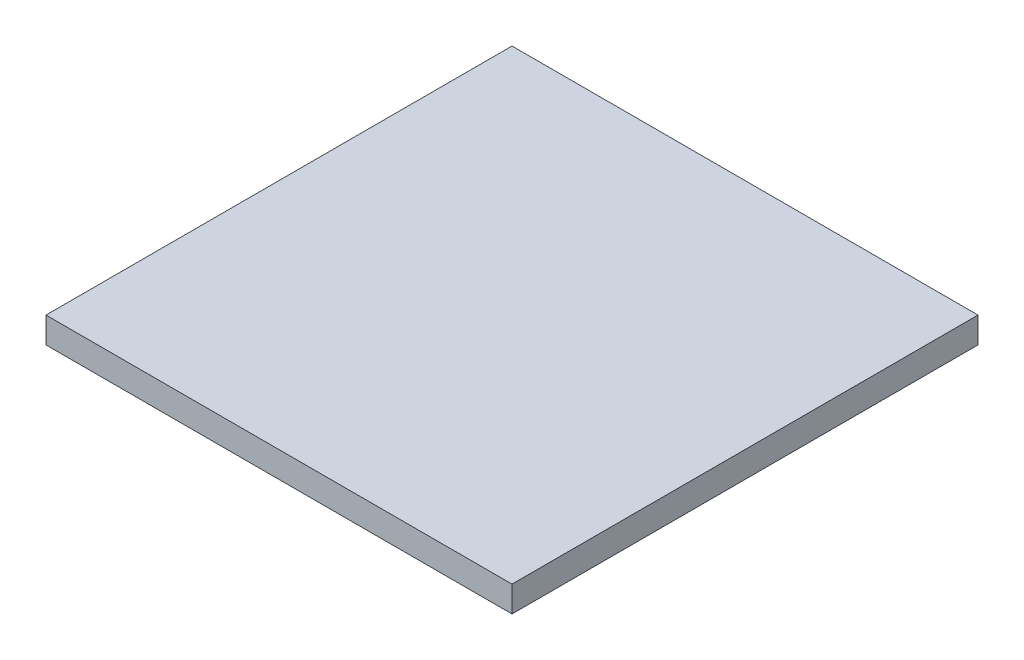
ISO-10303-21;
HEADER;
FILE_DESCRIPTION(('STEP AP214'),'2;1');
FILE_NAME('part.step','',(''),(''),'','','');
FILE_SCHEMA(('AUTOMOTIVE_DESIGN { 1 0 10303 214 1 1 1 1 }'));
ENDSEC;
DATA;
#1=APPLICATION_CONTEXT('core data for automotive mechanical design processes');
#2=APPLICATION_PROTOCOL_DEFINITION('international standard','automotive_design',2000,#1);
#3=PRODUCT_CONTEXT('',#1,'mechanical');
#4=PRODUCT('Part','Part','',(#3));
#5=PRODUCT_RELATED_PRODUCT_CATEGORY('part','',(#4));
#6=PRODUCT_DEFINITION_FORMATION('','',#4);
#7=PRODUCT_DEFINITION_CONTEXT('part definition',#1,'design');
#8=PRODUCT_DEFINITION('design','',#6,#7);
#9=PRODUCT_DEFINITION_SHAPE('','',#8);
#10=(LENGTH_UNIT() NAMED_UNIT(*) SI_UNIT(.MILLI.,.METRE.));
#11=(NAMED_UNIT(*) PLANE_ANGLE_UNIT() SI_UNIT($,.RADIAN.));
#12=(NAMED_UNIT(*) SI_UNIT($,.STERADIAN.) SOLID_ANGLE_UNIT());
#13=UNCERTAINTY_MEASURE_WITH_UNIT(LENGTH_MEASURE(1.E-05),#10,'distance_accuracy_value','');
#14=(GEOMETRIC_REPRESENTATION_CONTEXT(3) GLOBAL_UNCERTAINTY_ASSIGNED_CONTEXT((#13)) GLOBAL_UNIT_ASSIGNED_CONTEXT((#10,
#11,#12)) REPRESENTATION_CONTEXT('',''));
#15=CARTESIAN_POINT('',(0.,0.,0.));
#16=DIRECTION('',(0.,0.,1.));
#17=DIRECTION('',(1.,0.,0.));
#18=AXIS2_PLACEMENT_3D('',#15,#16,#17);
#19=CARTESIAN_POINT('',(0.,0.,450.));
#20=DIRECTION('',(-1.,0.,0.));
#21=DIRECTION('',(0.,0.,1.));
#22=AXIS2_PLACEMENT_3D('',#19,#20,#21);
#23=PLANE('',#22);
#24=DIRECTION('',(0.,1.,0.));
#25=VECTOR('',#24,1.);
#26=CARTESIAN_POINT('',(0.,0.,0.));
#27=LINE('',#26,#25);
#28=CARTESIAN_POINT('',(0.,0.,0.));
#29=VERTEX_POINT('',#28);
#30=CARTESIAN_POINT('',(0.,25.,0.));
#31=VERTEX_POINT('',#30);
#32=EDGE_CURVE('E96',#29,#31,#27,.T.);
#33=ORIENTED_EDGE('',*,*,#32,.T.);
#34=DIRECTION('',(0.,0.,-1.));
#35=VECTOR('',#34,1.);
#36=CARTESIAN_POINT('',(0.,25.,450.));
#37=LINE('',#36,#35);
#38=CARTESIAN_POINT('',(0.,25.,450.));
#39=VERTEX_POINT('',#38);
#40=EDGE_CURVE('E11',#39,#31,#37,.T.);
#41=ORIENTED_EDGE('',*,*,#40,.F.);
#42=DIRECTION('',(0.,1.,0.));
#43=VECTOR('',#42,1.);
#44=CARTESIAN_POINT('',(0.,0.,450.));
#45=LINE('',#44,#43);
#46=CARTESIAN_POINT('',(0.,0.,450.));
#47=VERTEX_POINT('',#46);
#48=EDGE_CURVE('E84',#47,#39,#45,.T.);
#49=ORIENTED_EDGE('',*,*,#48,.F.);
#50=DIRECTION('',(0.,0.,-1.));
#51=VECTOR('',#50,1.);
#52=CARTESIAN_POINT('',(0.,0.,450.));
#53=LINE('',#52,#51);
#54=EDGE_CURVE('E92',#47,#29,#53,.T.);
#55=ORIENTED_EDGE('',*,*,#54,.T.);
#56=EDGE_LOOP('',(#33,#41,#49,#55));
#57=FACE_BOUND('',#56,.T.);
#58=ADVANCED_FACE('F33',(#57),#23,.F.);
#59=CARTESIAN_POINT('',(0.,25.,450.));
#60=DIRECTION('',(0.,-1.,0.));
#61=DIRECTION('',(1.,0.,0.));
#62=AXIS2_PLACEMENT_3D('',#59,#60,#61);
#63=PLANE('',#62);
#64=DIRECTION('',(-1.,0.,0.));
#65=VECTOR('',#64,1.);
#66=CARTESIAN_POINT('',(0.,25.,0.));
#67=LINE('',#66,#65);
#68=CARTESIAN_POINT('',(-450.,24.9999999999999,0.));
#69=VERTEX_POINT('',#68);
#70=EDGE_CURVE('E88',#31,#69,#67,.T.);
#71=ORIENTED_EDGE('',*,*,#70,.T.);
#72=DIRECTION('',(0.,0.,-1.));
#73=VECTOR('',#72,1.);
#74=CARTESIAN_POINT('',(-450.,24.9999999999999,450.));
#75=LINE('',#74,#73);
#76=CARTESIAN_POINT('',(-450.,24.9999999999999,450.));
#77=VERTEX_POINT('',#76);
#78=EDGE_CURVE('E41',#77,#69,#75,.T.);
#79=ORIENTED_EDGE('',*,*,#78,.F.);
#80=DIRECTION('',(-1.,0.,0.));
#81=VECTOR('',#80,1.);
#82=CARTESIAN_POINT('',(0.,25.,450.));
#83=LINE('',#82,#81);
#84=EDGE_CURVE('E79',#39,#77,#83,.T.);
#85=ORIENTED_EDGE('',*,*,#84,.F.);
#86=ORIENTED_EDGE('',*,*,#40,.T.);
#87=EDGE_LOOP('',(#71,#79,#85,#86));
#88=FACE_BOUND('',#87,.T.);
#89=ADVANCED_FACE('F87',(#88),#63,.F.);
#90=CARTESIAN_POINT('',(-450.,0.,450.));
#91=DIRECTION('',(1.,0.,0.));
#92=DIRECTION('',(0.,0.,-1.));
#93=AXIS2_PLACEMENT_3D('',#90,#91,#92);
#94=PLANE('',#93);
#95=DIRECTION('',(0.,-1.,0.));
#96=VECTOR('',#95,1.);
#97=CARTESIAN_POINT('',(-450.,0.,0.));
#98=LINE('',#97,#96);
#99=CARTESIAN_POINT('',(-450.,0.,0.));
#100=VERTEX_POINT('',#99);
#101=EDGE_CURVE('E66',#69,#100,#98,.T.);
#102=ORIENTED_EDGE('',*,*,#101,.T.);
#103=DIRECTION('',(0.,0.,-1.));
#104=VECTOR('',#103,1.);
#105=CARTESIAN_POINT('',(-450.,0.,450.));
#106=LINE('',#105,#104);
#107=CARTESIAN_POINT('',(-450.,0.,450.));
#108=VERTEX_POINT('',#107);
#109=EDGE_CURVE('E89',#108,#100,#106,.T.);
#110=ORIENTED_EDGE('',*,*,#109,.F.);
#111=DIRECTION('',(0.,-1.,0.));
#112=VECTOR('',#111,1.);
#113=CARTESIAN_POINT('',(-450.,0.,450.));
#114=LINE('',#113,#112);
#115=EDGE_CURVE('E82',#77,#108,#114,.T.);
#116=ORIENTED_EDGE('',*,*,#115,.F.);
#117=ORIENTED_EDGE('',*,*,#78,.T.);
#118=EDGE_LOOP('',(#102,#110,#116,#117));
#119=FACE_BOUND('',#118,.T.);
#120=ADVANCED_FACE('F90',(#119),#94,.F.);
#121=CARTESIAN_POINT('',(0.,0.,450.));
#122=DIRECTION('',(0.,1.,0.));
#123=DIRECTION('',(-1.,0.,0.));
#124=AXIS2_PLACEMENT_3D('',#121,#122,#123);
#125=PLANE('',#124);
#126=DIRECTION('',(1.,0.,0.));
#127=VECTOR('',#126,1.);
#128=CARTESIAN_POINT('',(0.,0.,0.));
#129=LINE('',#128,#127);
#130=EDGE_CURVE('E72',#100,#29,#129,.T.);
#131=ORIENTED_EDGE('',*,*,#130,.T.);
#132=ORIENTED_EDGE('',*,*,#54,.F.);
#133=DIRECTION('',(1.,0.,0.));
#134=VECTOR('',#133,1.);
#135=CARTESIAN_POINT('',(0.,0.,450.));
#136=LINE('',#135,#134);
#137=EDGE_CURVE('E49',#108,#47,#136,.T.);
#138=ORIENTED_EDGE('',*,*,#137,.F.);
#139=ORIENTED_EDGE('',*,*,#109,.T.);
#140=EDGE_LOOP('',(#131,#132,#138,#139));
#141=FACE_BOUND('',#140,.T.);
#142=ADVANCED_FACE('F103',(#141),#125,.F.);
#143=CARTESIAN_POINT('',(0.,0.,450.));
#144=DIRECTION('',(0.,0.,1.));
#145=DIRECTION('',(1.,0.,0.));
#146=AXIS2_PLACEMENT_3D('',#143,#144,#145);
#147=PLANE('',#146);
#148=ORIENTED_EDGE('',*,*,#48,.T.);
#149=ORIENTED_EDGE('',*,*,#84,.T.);
#150=ORIENTED_EDGE('',*,*,#115,.T.);
#151=ORIENTED_EDGE('',*,*,#137,.T.);
#152=EDGE_LOOP('',(#148,#149,#150,#151));
#153=FACE_BOUND('',#152,.T.);
#154=ADVANCED_FACE('F80',(#153),#147,.T.);
#155=CARTESIAN_POINT('',(0.,0.,0.));
#156=DIRECTION('',(0.,0.,1.));
#157=DIRECTION('',(1.,0.,0.));
#158=AXIS2_PLACEMENT_3D('',#155,#156,#157);
#159=PLANE('',#158);
#160=ORIENTED_EDGE('',*,*,#32,.F.);
#161=ORIENTED_EDGE('',*,*,#130,.F.);
#162=ORIENTED_EDGE('',*,*,#101,.F.);
#163=ORIENTED_EDGE('',*,*,#70,.F.);
#164=EDGE_LOOP('',(#160,#161,#162,#163));
#165=FACE_BOUND('',#164,.T.);
#166=ADVANCED_FACE('F106',(#165),#159,.F.);
#167=CLOSED_SHELL('',(#58,#89,#120,#142,#154,#166));
#168=MANIFOLD_SOLID_BREP('B2',#167);
#169=ADVANCED_BREP_SHAPE_REPRESENTATION('',(#18,#168),#14);
#170=SHAPE_DEFINITION_REPRESENTATION(#9,#169);
ENDSEC;
END-ISO-10303-21;
